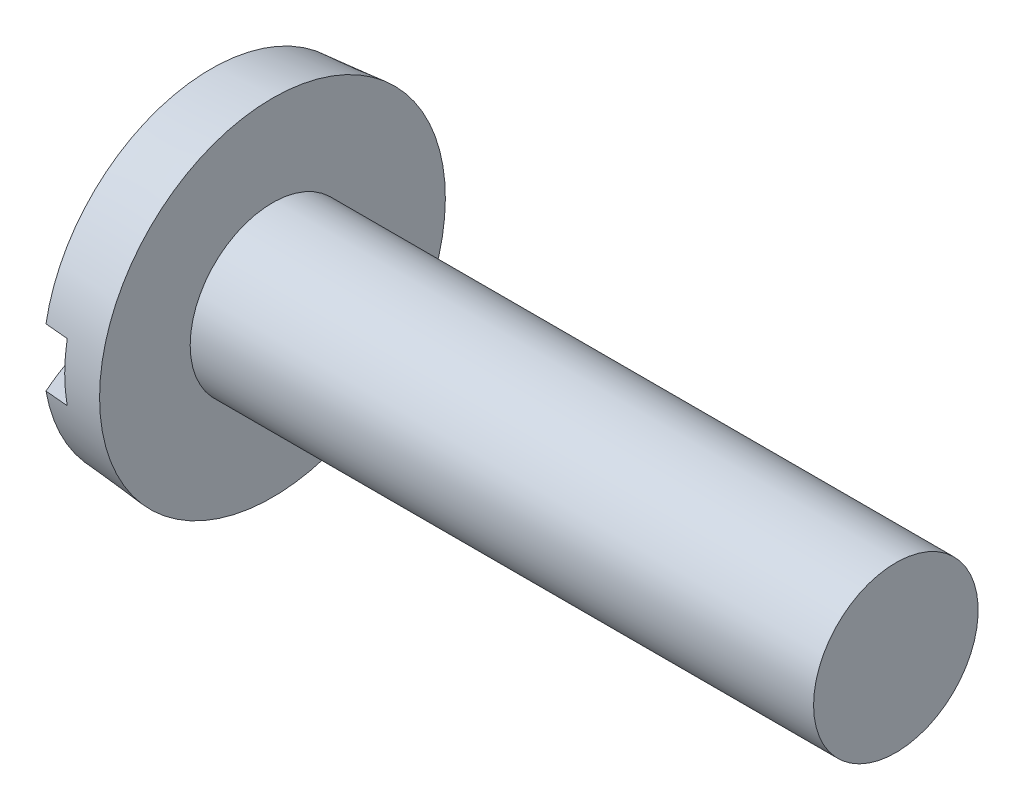
ISO-10303-21;
HEADER;
FILE_DESCRIPTION(('STEP AP214'),'2;1');
FILE_NAME('part.step','',(''),(''),'','','');
FILE_SCHEMA(('AUTOMOTIVE_DESIGN { 1 0 10303 214 1 1 1 1 }'));
ENDSEC;
DATA;
#1=APPLICATION_CONTEXT('core data for automotive mechanical design processes');
#2=APPLICATION_PROTOCOL_DEFINITION('international standard','automotive_design',2000,#1);
#3=PRODUCT_CONTEXT('',#1,'mechanical');
#4=PRODUCT('Part','Part','',(#3));
#5=PRODUCT_RELATED_PRODUCT_CATEGORY('part','',(#4));
#6=PRODUCT_DEFINITION_FORMATION('','',#4);
#7=PRODUCT_DEFINITION_CONTEXT('part definition',#1,'design');
#8=PRODUCT_DEFINITION('design','',#6,#7);
#9=PRODUCT_DEFINITION_SHAPE('','',#8);
#10=(LENGTH_UNIT() NAMED_UNIT(*) SI_UNIT(.MILLI.,.METRE.));
#11=(NAMED_UNIT(*) PLANE_ANGLE_UNIT() SI_UNIT($,.RADIAN.));
#12=(NAMED_UNIT(*) SI_UNIT($,.STERADIAN.) SOLID_ANGLE_UNIT());
#13=UNCERTAINTY_MEASURE_WITH_UNIT(LENGTH_MEASURE(1.E-05),#10,'distance_accuracy_value','');
#14=(GEOMETRIC_REPRESENTATION_CONTEXT(3) GLOBAL_UNCERTAINTY_ASSIGNED_CONTEXT((#13)) GLOBAL_UNIT_ASSIGNED_CONTEXT((#10,
#11,#12)) REPRESENTATION_CONTEXT('',''));
#15=CARTESIAN_POINT('',(0.,0.,0.));
#16=DIRECTION('',(0.,0.,1.));
#17=DIRECTION('',(1.,0.,0.));
#18=AXIS2_PLACEMENT_3D('',#15,#16,#17);
#19=CARTESIAN_POINT('',(6.14054579032415,0.,0.));
#20=DIRECTION('',(-1.,0.,0.));
#21=DIRECTION('',(0.,1.,0.));
#22=AXIS2_PLACEMENT_3D('',#19,#20,#21);
#23=SPHERICAL_SURFACE('',#22,6.14054579032415);
#24=CARTESIAN_POINT('',(0.558800000000002,0.,0.));
#25=DIRECTION('',(-1.,0.,0.));
#26=DIRECTION('',(0.,0.,1.));
#27=AXIS2_PLACEMENT_3D('',#24,#25,#26);
#28=CIRCLE('',#27,2.55937815401833);
#29=CARTESIAN_POINT('',(0.558800000000002,-0.4445,-2.52048334358041));
#30=VERTEX_POINT('',#29);
#31=CARTESIAN_POINT('',(0.558800000000001,-0.4445,2.52048334358041));
#32=VERTEX_POINT('',#31);
#33=EDGE_CURVE('E105',#30,#32,#28,.T.);
#34=ORIENTED_EDGE('',*,*,#33,.T.);
#35=CARTESIAN_POINT('',(6.14054579032415,-0.4445,0.));
#36=DIRECTION('',(0.,1.,0.));
#37=DIRECTION('',(0.,0.,1.));
#38=AXIS2_PLACEMENT_3D('',#35,#36,#37);
#39=CIRCLE('',#38,6.1244364926961);
#40=EDGE_CURVE('E80',#32,#30,#39,.F.);
#41=ORIENTED_EDGE('',*,*,#40,.T.);
#42=EDGE_LOOP('',(#34,#41));
#43=FACE_BOUND('',#42,.T.);
#44=ADVANCED_FACE('F33',(#43),#23,.T.);
#45=CARTESIAN_POINT('',(0.558800000000001,0.444499999999999,2.52048334358041));
#46=VERTEX_POINT('',#45);
#47=CARTESIAN_POINT('',(0.558800000000002,0.4445,-2.52048334358041));
#48=VERTEX_POINT('',#47);
#49=EDGE_CURVE('E101',#46,#48,#28,.T.);
#50=ORIENTED_EDGE('',*,*,#49,.T.);
#51=CARTESIAN_POINT('',(6.14054579032415,0.4445,0.));
#52=DIRECTION('',(0.,-1.,0.));
#53=DIRECTION('',(0.,0.,-1.));
#54=AXIS2_PLACEMENT_3D('',#51,#52,#53);
#55=CIRCLE('',#54,6.1244364926961);
#56=EDGE_CURVE('E115',#48,#46,#55,.F.);
#57=ORIENTED_EDGE('',*,*,#56,.T.);
#58=EDGE_LOOP('',(#50,#57));
#59=FACE_BOUND('',#58,.T.);
#60=ADVANCED_FACE('F121',(#59),#23,.T.);
#61=CARTESIAN_POINT('',(1.4986,0.,0.));
#62=DIRECTION('',(1.,0.,0.));
#63=DIRECTION('',(0.,0.,-1.));
#64=AXIS2_PLACEMENT_3D('',#61,#62,#63);
#65=CONICAL_SURFACE('',#64,2.6416,0.0872664625997224);
#66=CARTESIAN_POINT('',(1.4986,0.,0.));
#67=DIRECTION('',(-1.,0.,0.));
#68=DIRECTION('',(0.,0.,1.));
#69=AXIS2_PLACEMENT_3D('',#66,#67,#68);
#70=CIRCLE('',#69,2.6416);
#71=CARTESIAN_POINT('',(1.4986,0.,2.6416));
#72=VERTEX_POINT('',#71);
#73=EDGE_CURVE('E108',#72,#72,#70,.T.);
#74=ORIENTED_EDGE('',*,*,#73,.T.);
#75=EDGE_LOOP('',(#74));
#76=FACE_BOUND('',#75,.T.);
#77=CARTESIAN_POINT('',(-4.02316770320583,-0.4445,2.11224435261334));
#78=CARTESIAN_POINT('',(-2.70478241528805,-0.4445,2.23009745858033));
#79=CARTESIAN_POINT('',(-1.38636378012758,-0.4445,2.34757641088396));
#80=CARTESIAN_POINT('',(0.183798850530632,-0.4445,2.4871654114245));
#81=CARTESIAN_POINT('',(0.43551987087664,-0.4445,2.50953380682439));
#82=CARTESIAN_POINT('',(2.25741472189879,-0.4445,2.6713648402123));
#83=CARTESIAN_POINT('',(3.82761899459401,-0.4445,2.8104849514945));
#84=CARTESIAN_POINT('',(5.3978384611118,-0.4445,2.94943259914974));
#85=B_SPLINE_CURVE_WITH_KNOTS('',3,(#77,#78,#79,#80,#81,#82,#83,#84),.UNSPECIFIED.,.F.,.F.,(4,2,
2,4),(0.,3.97092691876795,4.72906566195698,9.45813122267656),.UNSPECIFIED.);
#86=CARTESIAN_POINT('',(0.9144,-0.4445,2.55206850323029));
#87=VERTEX_POINT('',#86);
#88=EDGE_CURVE('E11',#32,#87,#85,.T.);
#89=ORIENTED_EDGE('',*,*,#88,.F.);
#90=ORIENTED_EDGE('',*,*,#33,.F.);
#91=CARTESIAN_POINT('',(5.3978384611118,-0.4445,-2.94943259914974));
#92=CARTESIAN_POINT('',(4.61272794664959,-0.4445,-2.87996726680811));
#93=CARTESIAN_POINT('',(3.82762196755724,-0.4445,-2.8104506218326));
#94=CARTESIAN_POINT('',(2.25742206388612,-0.4445,-2.67128178581139));
#95=CARTESIAN_POINT('',(1.47232813930675,-0.4445,-2.60162959477254));
#96=CARTESIAN_POINT('',(-0.0978447686725512,-0.4445,-2.46215673723073));
#97=CARTESIAN_POINT('',(-0.882923752072148,-0.4445,-2.39233607072393));
#98=CARTESIAN_POINT('',(-2.45306186336721,-0.4445,-2.2524714145734));
#99=CARTESIAN_POINT('',(-3.23812099126167,-0.4445,-2.1824274249183));
#100=CARTESIAN_POINT('',(-4.02316770320583,-0.4445,-2.11224435261334));
#101=B_SPLINE_CURVE_WITH_KNOTS('',3,(#91,#92,#93,#94,#95,#96,#97,#98,#99,#100),.UNSPECIFIED.,
.F.,.F.,(4,2,2,2,4),(0.,2.36453284884075,4.72906557834066,7.09359836162096,9.45813126526523),.UNSPECIFIED.);
#102=CARTESIAN_POINT('',(0.9144,-0.4445,-2.55206850323029));
#103=VERTEX_POINT('',#102);
#104=EDGE_CURVE('E61',#103,#30,#101,.T.);
#105=ORIENTED_EDGE('',*,*,#104,.F.);
#106=CARTESIAN_POINT('',(0.9144,0.,0.));
#107=DIRECTION('',(1.,0.,0.));
#108=DIRECTION('',(0.,0.,-1.));
#109=AXIS2_PLACEMENT_3D('',#106,#107,#108);
#110=CIRCLE('',#109,2.59048912276815);
#111=CARTESIAN_POINT('',(0.9144,0.4445,-2.55206850323029));
#112=VERTEX_POINT('',#111);
#113=EDGE_CURVE('E88',#103,#112,#110,.T.);
#114=ORIENTED_EDGE('',*,*,#113,.T.);
#115=CARTESIAN_POINT('',(-4.02316770320583,0.4445,-2.11224435261334));
#116=CARTESIAN_POINT('',(-2.70478241528805,0.4445,-2.23009745858033));
#117=CARTESIAN_POINT('',(-1.38636378012758,0.4445,-2.34757641088396));
#118=CARTESIAN_POINT('',(0.183798850530632,0.4445,-2.4871654114245));
#119=CARTESIAN_POINT('',(0.43551987087664,0.4445,-2.50953380682439));
#120=CARTESIAN_POINT('',(2.25741472189879,0.4445,-2.6713648402123));
#121=CARTESIAN_POINT('',(3.82761899459401,0.4445,-2.8104849514945));
#122=CARTESIAN_POINT('',(5.3978384611118,0.4445,-2.94943259914974));
#123=B_SPLINE_CURVE_WITH_KNOTS('',3,(#115,#116,#117,#118,#119,#120,#121,#122),.UNSPECIFIED.,.F.,
.F.,(4,2,2,4),(0.,3.97092691876795,4.72906566195698,9.45813122267656),.UNSPECIFIED.);
#124=EDGE_CURVE('E94',#48,#112,#123,.T.);
#125=ORIENTED_EDGE('',*,*,#124,.F.);
#126=ORIENTED_EDGE('',*,*,#49,.F.);
#127=CARTESIAN_POINT('',(5.3978384611118,0.444499999999999,2.94943259914974));
#128=CARTESIAN_POINT('',(4.61272794664959,0.444499999999999,2.87996726680811));
#129=CARTESIAN_POINT('',(3.82762196755723,0.444499999999999,2.8104506218326));
#130=CARTESIAN_POINT('',(2.25742206388612,0.444499999999999,2.67128178581139));
#131=CARTESIAN_POINT('',(1.47232813930675,0.444499999999999,2.60162959477254));
#132=CARTESIAN_POINT('',(-0.0978447686725522,0.444499999999999,2.46215673723073));
#133=CARTESIAN_POINT('',(-0.882923752072149,0.444499999999999,2.39233607072393));
#134=CARTESIAN_POINT('',(-2.45306186336721,0.444499999999999,2.2524714145734));
#135=CARTESIAN_POINT('',(-3.23812099126167,0.444499999999999,2.1824274249183));
#136=CARTESIAN_POINT('',(-4.02316770320583,0.444499999999999,2.11224435261334));
#137=B_SPLINE_CURVE_WITH_KNOTS('',3,(#127,#128,#129,#130,#131,#132,#133,#134,#135,#136),
.UNSPECIFIED.,.F.,.F.,(4,2,2,2,4),(0.,2.36453284884075,4.72906557834066,7.09359836162096,
9.45813126526523),.UNSPECIFIED.);
#138=CARTESIAN_POINT('',(0.9144,0.444499999999999,2.55206850323029));
#139=VERTEX_POINT('',#138);
#140=EDGE_CURVE('E46',#139,#46,#137,.T.);
#141=ORIENTED_EDGE('',*,*,#140,.F.);
#142=EDGE_CURVE('E86',#139,#87,#110,.T.);
#143=ORIENTED_EDGE('',*,*,#142,.T.);
#144=EDGE_LOOP('',(#89,#90,#105,#114,#125,#126,#141,#143));
#145=FACE_BOUND('',#144,.T.);
#146=ADVANCED_FACE('F91',(#76,#145),#65,.T.);
#147=CARTESIAN_POINT('',(-25.4,0.,0.));
#148=DIRECTION('',(-1.,0.,0.));
#149=DIRECTION('',(0.,0.,1.));
#150=AXIS2_PLACEMENT_3D('',#147,#148,#149);
#151=CYLINDRICAL_SURFACE('',#150,1.2573);
#152=CARTESIAN_POINT('',(11.0236,0.,0.));
#153=DIRECTION('',(-1.,0.,0.));
#154=DIRECTION('',(0.,0.,1.));
#155=AXIS2_PLACEMENT_3D('',#152,#153,#154);
#156=CIRCLE('',#155,1.2573);
#157=CARTESIAN_POINT('',(11.0236,0.,1.2573));
#158=VERTEX_POINT('',#157);
#159=EDGE_CURVE('E98',#158,#158,#156,.T.);
#160=ORIENTED_EDGE('',*,*,#159,.T.);
#161=EDGE_LOOP('',(#160));
#162=FACE_BOUND('',#161,.T.);
#163=CARTESIAN_POINT('',(1.4986,0.,0.));
#164=DIRECTION('',(-1.,0.,0.));
#165=DIRECTION('',(0.,0.,1.));
#166=AXIS2_PLACEMENT_3D('',#163,#164,#165);
#167=CIRCLE('',#166,1.2573);
#168=CARTESIAN_POINT('',(1.4986,0.,1.2573));
#169=VERTEX_POINT('',#168);
#170=EDGE_CURVE('E111',#169,#169,#167,.T.);
#171=ORIENTED_EDGE('',*,*,#170,.F.);
#172=EDGE_LOOP('',(#171));
#173=FACE_BOUND('',#172,.T.);
#174=ADVANCED_FACE('F35',(#162,#173),#151,.T.);
#175=CARTESIAN_POINT('',(11.0236,1.2573,0.));
#176=DIRECTION('',(1.,0.,0.));
#177=DIRECTION('',(0.,0.,-1.));
#178=AXIS2_PLACEMENT_3D('',#175,#176,#177);
#179=PLANE('',#178);
#180=ORIENTED_EDGE('',*,*,#159,.F.);
#181=EDGE_LOOP('',(#180));
#182=FACE_BOUND('',#181,.T.);
#183=ADVANCED_FACE('F132',(#182),#179,.T.);
#184=CARTESIAN_POINT('',(1.4986,1.2573,0.));
#185=DIRECTION('',(-1.,0.,0.));
#186=DIRECTION('',(0.,0.,1.));
#187=AXIS2_PLACEMENT_3D('',#184,#185,#186);
#188=PLANE('',#187);
#189=ORIENTED_EDGE('',*,*,#73,.F.);
#190=EDGE_LOOP('',(#189));
#191=FACE_BOUND('',#190,.T.);
#192=ORIENTED_EDGE('',*,*,#170,.T.);
#193=EDGE_LOOP('',(#192));
#194=FACE_BOUND('',#193,.T.);
#195=ADVANCED_FACE('F134',(#191,#194),#188,.F.);
#196=CARTESIAN_POINT('',(0.9144,-0.4445,2.6416));
#197=DIRECTION('',(0.,1.,0.));
#198=DIRECTION('',(0.,0.,1.));
#199=AXIS2_PLACEMENT_3D('',#196,#197,#198);
#200=PLANE('',#199);
#201=ORIENTED_EDGE('',*,*,#104,.T.);
#202=ORIENTED_EDGE('',*,*,#40,.F.);
#203=ORIENTED_EDGE('',*,*,#88,.T.);
#204=DIRECTION('',(0.,0.,-1.));
#205=VECTOR('',#204,1.);
#206=CARTESIAN_POINT('',(0.9144,-0.4445,2.6416));
#207=LINE('',#206,#205);
#208=EDGE_CURVE('E79',#87,#103,#207,.T.);
#209=ORIENTED_EDGE('',*,*,#208,.T.);
#210=EDGE_LOOP('',(#201,#202,#203,#209));
#211=FACE_BOUND('',#210,.T.);
#212=ADVANCED_FACE('F78',(#211),#200,.T.);
#213=CARTESIAN_POINT('',(0.9144,0.4445,-2.6416));
#214=DIRECTION('',(0.,-1.,0.));
#215=DIRECTION('',(0.,0.,-1.));
#216=AXIS2_PLACEMENT_3D('',#213,#214,#215);
#217=PLANE('',#216);
#218=ORIENTED_EDGE('',*,*,#124,.T.);
#219=DIRECTION('',(0.,0.,1.));
#220=VECTOR('',#219,1.);
#221=CARTESIAN_POINT('',(0.9144,0.4445,-2.6416));
#222=LINE('',#221,#220);
#223=EDGE_CURVE('E53',#112,#139,#222,.T.);
#224=ORIENTED_EDGE('',*,*,#223,.T.);
#225=ORIENTED_EDGE('',*,*,#140,.T.);
#226=ORIENTED_EDGE('',*,*,#56,.F.);
#227=EDGE_LOOP('',(#218,#224,#225,#226));
#228=FACE_BOUND('',#227,.T.);
#229=ADVANCED_FACE('F119',(#228),#217,.T.);
#230=CARTESIAN_POINT('',(0.9144,-0.4445,-2.6416));
#231=DIRECTION('',(1.,0.,0.));
#232=DIRECTION('',(0.,0.,-1.));
#233=AXIS2_PLACEMENT_3D('',#230,#231,#232);
#234=PLANE('',#233);
#235=ORIENTED_EDGE('',*,*,#223,.F.);
#236=ORIENTED_EDGE('',*,*,#113,.F.);
#237=ORIENTED_EDGE('',*,*,#208,.F.);
#238=ORIENTED_EDGE('',*,*,#142,.F.);
#239=EDGE_LOOP('',(#235,#236,#237,#238));
#240=FACE_BOUND('',#239,.T.);
#241=ADVANCED_FACE('F85',(#240),#234,.F.);
#242=CLOSED_SHELL('',(#44,#60,#146,#174,#183,#195,#212,#229,#241));
#243=MANIFOLD_SOLID_BREP('B2',#242);
#244=ADVANCED_BREP_SHAPE_REPRESENTATION('',(#18,#243),#14);
#245=SHAPE_DEFINITION_REPRESENTATION(#9,#244);
ENDSEC;
END-ISO-10303-21;
